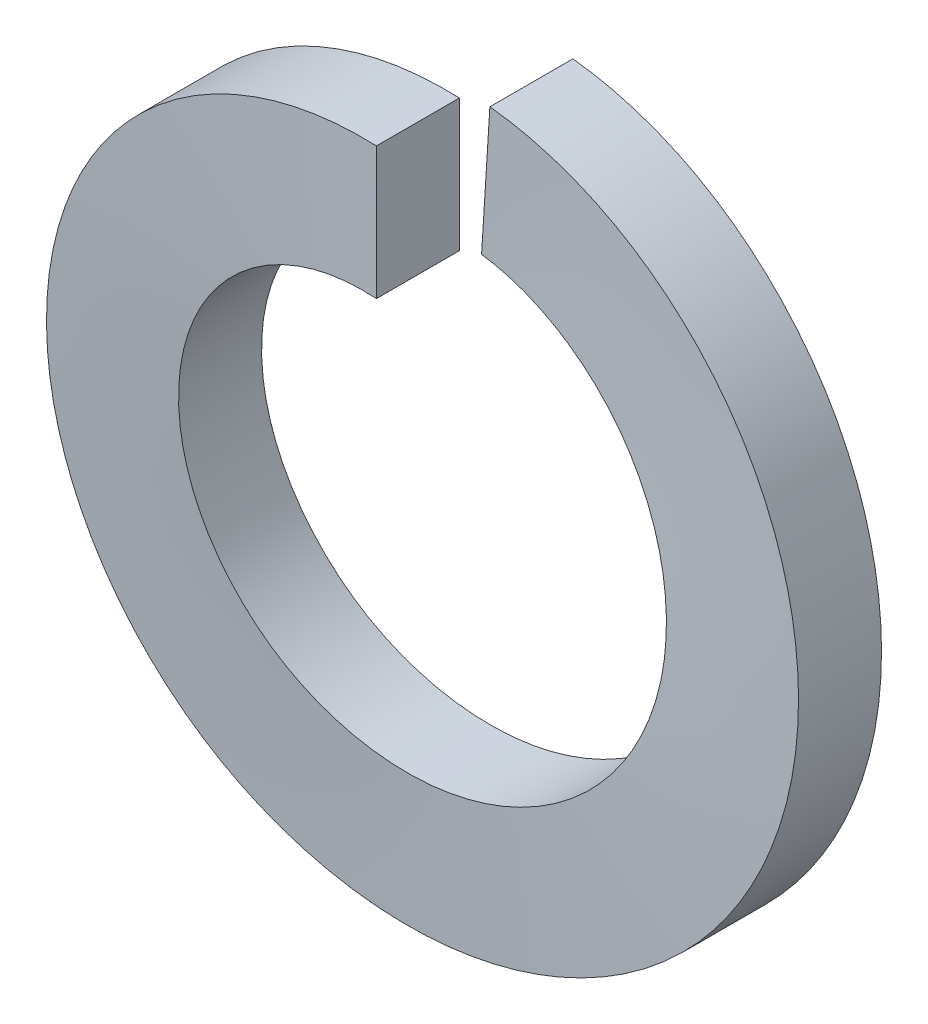
ISO-10303-21;
HEADER;
FILE_DESCRIPTION(('STEP AP214'),'2;1');
FILE_NAME('part.step','',(''),(''),'','','');
FILE_SCHEMA(('AUTOMOTIVE_DESIGN { 1 0 10303 214 1 1 1 1 }'));
ENDSEC;
DATA;
#1=APPLICATION_CONTEXT('core data for automotive mechanical design processes');
#2=APPLICATION_PROTOCOL_DEFINITION('international standard','automotive_design',2000,#1);
#3=PRODUCT_CONTEXT('',#1,'mechanical');
#4=PRODUCT('Part','Part','',(#3));
#5=PRODUCT_RELATED_PRODUCT_CATEGORY('part','',(#4));
#6=PRODUCT_DEFINITION_FORMATION('','',#4);
#7=PRODUCT_DEFINITION_CONTEXT('part definition',#1,'design');
#8=PRODUCT_DEFINITION('design','',#6,#7);
#9=PRODUCT_DEFINITION_SHAPE('','',#8);
#10=(LENGTH_UNIT() NAMED_UNIT(*) SI_UNIT(.MILLI.,.METRE.));
#11=(NAMED_UNIT(*) PLANE_ANGLE_UNIT() SI_UNIT($,.RADIAN.));
#12=(NAMED_UNIT(*) SI_UNIT($,.STERADIAN.) SOLID_ANGLE_UNIT());
#13=UNCERTAINTY_MEASURE_WITH_UNIT(LENGTH_MEASURE(1.E-05),#10,'distance_accuracy_value','');
#14=(GEOMETRIC_REPRESENTATION_CONTEXT(3) GLOBAL_UNCERTAINTY_ASSIGNED_CONTEXT((#13)) GLOBAL_UNIT_ASSIGNED_CONTEXT((#10,
#11,#12)) REPRESENTATION_CONTEXT('',''));
#15=CARTESIAN_POINT('',(0.,0.,0.));
#16=DIRECTION('',(0.,0.,1.));
#17=DIRECTION('',(1.,0.,0.));
#18=AXIS2_PLACEMENT_3D('',#15,#16,#17);
#19=CARTESIAN_POINT('',(0.,2.7625,0.8));
#20=DIRECTION('',(1.,0.,0.));
#21=DIRECTION('',(0.,1.,0.));
#22=AXIS2_PLACEMENT_3D('',#19,#20,#21);
#23=PLANE('',#22);
#24=CARTESIAN_POINT('',(0.,3.4,0.8));
#25=CARTESIAN_POINT('',(0.,2.125,0.8));
#26=(BOUNDED_CURVE() B_SPLINE_CURVE(1,(#24,#25),.UNSPECIFIED.,.F.,
.F.) B_SPLINE_CURVE_WITH_KNOTS((2,2),(0.,1.),
.UNSPECIFIED.) CURVE() GEOMETRIC_REPRESENTATION_ITEM() RATIONAL_B_SPLINE_CURVE((1.,1.)) REPRESENTATION_ITEM(''));
#27=CARTESIAN_POINT('',(0.,3.4,0.8));
#28=VERTEX_POINT('',#27);
#29=CARTESIAN_POINT('',(0.,2.125,0.8));
#30=VERTEX_POINT('',#29);
#31=EDGE_CURVE('E9',#28,#30,#26,.T.);
#32=ORIENTED_EDGE('',*,*,#31,.T.);
#33=CARTESIAN_POINT('',(0.,2.125,0.8));
#34=CARTESIAN_POINT('',(0.,2.125,0.));
#35=(BOUNDED_CURVE() B_SPLINE_CURVE(1,(#33,#34),.UNSPECIFIED.,.F.,
.F.) B_SPLINE_CURVE_WITH_KNOTS((2,2),(0.,1.),
.UNSPECIFIED.) CURVE() GEOMETRIC_REPRESENTATION_ITEM() RATIONAL_B_SPLINE_CURVE((1.,1.)) REPRESENTATION_ITEM(''));
#36=CARTESIAN_POINT('',(0.,2.125,0.));
#37=VERTEX_POINT('',#36);
#38=EDGE_CURVE('E30',#30,#37,#35,.T.);
#39=ORIENTED_EDGE('',*,*,#38,.T.);
#40=CARTESIAN_POINT('',(0.,2.125,0.));
#41=CARTESIAN_POINT('',(0.,3.4,0.));
#42=(BOUNDED_CURVE() B_SPLINE_CURVE(1,(#40,#41),.UNSPECIFIED.,.F.,
.F.) B_SPLINE_CURVE_WITH_KNOTS((2,2),(0.,1.),
.UNSPECIFIED.) CURVE() GEOMETRIC_REPRESENTATION_ITEM() RATIONAL_B_SPLINE_CURVE((1.,1.)) REPRESENTATION_ITEM(''));
#43=CARTESIAN_POINT('',(0.,3.4,0.));
#44=VERTEX_POINT('',#43);
#45=EDGE_CURVE('E82',#37,#44,#42,.T.);
#46=ORIENTED_EDGE('',*,*,#45,.T.);
#47=CARTESIAN_POINT('',(0.,3.4,0.));
#48=CARTESIAN_POINT('',(0.,3.4,0.8));
#49=(BOUNDED_CURVE() B_SPLINE_CURVE(1,(#47,#48),.UNSPECIFIED.,.F.,
.F.) B_SPLINE_CURVE_WITH_KNOTS((2,2),(0.,1.),
.UNSPECIFIED.) CURVE() GEOMETRIC_REPRESENTATION_ITEM() RATIONAL_B_SPLINE_CURVE((1.,1.)) REPRESENTATION_ITEM(''));
#50=EDGE_CURVE('E71',#44,#28,#49,.T.);
#51=ORIENTED_EDGE('',*,*,#50,.T.);
#52=EDGE_LOOP('',(#32,#39,#46,#51));
#53=FACE_BOUND('',#52,.T.);
#54=ADVANCED_FACE('F15',(#53),#23,.T.);
#55=CARTESIAN_POINT('',(0.153454677875225,2.43892716667354,-0.0803570287499307));
#56=DIRECTION('',(0.998026461794073,-0.0627947530776182,2.33393192424572E-05));
#57=DIRECTION('',(0.,-0.000371676238642485,-0.999999930928384));
#58=AXIS2_PLACEMENT_3D('',#55,#56,#57);
#59=PLANE('',#58);
#60=CARTESIAN_POINT('',(0.133445838291757,2.12080579219163,-0.0803565761972662));
#61=CARTESIAN_POINT('',(0.160126620391539,2.54496747826804,-0.0803570287499307));
#62=CARTESIAN_POINT('',(0.186814390456795,2.96912872464604,-0.0803570287499307));
#63=CARTESIAN_POINT('',(0.213502160311887,3.39328997103727,-0.0803570287584372));
#64=(BOUNDED_CURVE() B_SPLINE_CURVE(3,(#60,#61,#62,#63),.UNSPECIFIED.,.F.,
.F.) B_SPLINE_CURVE_WITH_KNOTS((4,4),(0.,1.),
.UNSPECIFIED.) CURVE() GEOMETRIC_REPRESENTATION_ITEM() RATIONAL_B_SPLINE_CURVE((1.,1.,1.,1.)) REPRESENTATION_ITEM(''));
#65=CARTESIAN_POINT('',(0.133445838291757,2.12080579219163,-0.0803565761972662));
#66=VERTEX_POINT('',#65);
#67=CARTESIAN_POINT('',(0.213502160311887,3.39328997103727,-0.0803570287584372));
#68=VERTEX_POINT('',#67);
#69=EDGE_CURVE('E83',#66,#68,#64,.T.);
#70=ORIENTED_EDGE('',*,*,#69,.T.);
#71=CARTESIAN_POINT('',(0.213502160311887,3.39328997103727,-0.0803570287584372));
#72=CARTESIAN_POINT('',(0.213508372057573,3.39328958020091,-0.347023695279839));
#73=CARTESIAN_POINT('',(0.213514583593094,3.39328918937777,-0.613690361801246));
#74=CARTESIAN_POINT('',(0.213513341161694,3.39328926751323,-0.880356576201521));
#75=(BOUNDED_CURVE() B_SPLINE_CURVE(3,(#71,#72,#73,#74),.UNSPECIFIED.,.F.,
.F.) B_SPLINE_CURVE_WITH_KNOTS((4,4),(0.,1.),
.UNSPECIFIED.) CURVE() GEOMETRIC_REPRESENTATION_ITEM() RATIONAL_B_SPLINE_CURVE((1.,1.,1.,1.)) REPRESENTATION_ITEM(''));
#76=CARTESIAN_POINT('',(0.213513341161694,3.39328926751323,-0.880356576201521));
#77=VERTEX_POINT('',#76);
#78=EDGE_CURVE('E21',#68,#77,#75,.T.);
#79=ORIENTED_EDGE('',*,*,#78,.T.);
#80=CARTESIAN_POINT('',(0.213513341161694,3.39328926751323,-0.880356576201521));
#81=CARTESIAN_POINT('',(0.18683302503823,2.96912755211347,-0.880356123666393));
#82=CARTESIAN_POINT('',(0.160145254973551,2.54496630574468,-0.880356123601026));
#83=CARTESIAN_POINT('',(0.133452826257232,2.12080535249323,-0.880356123644601));
#84=(BOUNDED_CURVE() B_SPLINE_CURVE(3,(#80,#81,#82,#83),.UNSPECIFIED.,.F.,
.F.) B_SPLINE_CURVE_WITH_KNOTS((4,4),(0.,1.),
.UNSPECIFIED.) CURVE() GEOMETRIC_REPRESENTATION_ITEM() RATIONAL_B_SPLINE_CURVE((1.,1.,1.,1.)) REPRESENTATION_ITEM(''));
#85=CARTESIAN_POINT('',(0.133452826257232,2.12080535249323,-0.880356123644601));
#86=VERTEX_POINT('',#85);
#87=EDGE_CURVE('E91',#77,#86,#84,.T.);
#88=ORIENTED_EDGE('',*,*,#87,.T.);
#89=CARTESIAN_POINT('',(0.133452826257232,2.12080535249323,-0.880356123644601));
#90=CARTESIAN_POINT('',(0.133451273373352,2.12080545019902,-0.61368945701425));
#91=CARTESIAN_POINT('',(0.133445061837831,2.12080584102217,-0.347022790492843));
#92=CARTESIAN_POINT('',(0.133445838291757,2.12080579219163,-0.0803565761972662));
#93=(BOUNDED_CURVE() B_SPLINE_CURVE(3,(#89,#90,#91,#92),.UNSPECIFIED.,.F.,
.F.) B_SPLINE_CURVE_WITH_KNOTS((4,4),(0.,1.),
.UNSPECIFIED.) CURVE() GEOMETRIC_REPRESENTATION_ITEM() RATIONAL_B_SPLINE_CURVE((1.,1.,1.,1.)) REPRESENTATION_ITEM(''));
#94=EDGE_CURVE('E100',#86,#66,#93,.T.);
#95=ORIENTED_EDGE('',*,*,#94,.T.);
#96=EDGE_LOOP('',(#70,#79,#88,#95));
#97=FACE_BOUND('',#96,.T.);
#98=ADVANCED_FACE('F168',(#97),#59,.F.);
#99=CARTESIAN_POINT('',(0.,3.4,0.8));
#100=CARTESIAN_POINT('',(-1.40832611206852,3.4,0.744444444444444));
#101=CARTESIAN_POINT('',(-2.40416305603426,2.40416305603426,0.688888888888889));
#102=CARTESIAN_POINT('',(-3.4,1.40832611206852,0.633333333333333));
#103=CARTESIAN_POINT('',(-3.4,0.,0.577777777777778));
#104=CARTESIAN_POINT('',(-3.4,-1.40832611206852,0.522222222222222));
#105=CARTESIAN_POINT('',(-2.40416305603426,-2.40416305603426,0.466666666666667));
#106=CARTESIAN_POINT('',(-1.40832611206852,-3.4,0.411111111111111));
#107=CARTESIAN_POINT('',(0.,-3.4,0.355555555555556));
#108=CARTESIAN_POINT('',(1.40832611206852,-3.4,0.3));
#109=CARTESIAN_POINT('',(2.40416305603426,-2.40416305603426,0.244444444444444));
#110=CARTESIAN_POINT('',(3.4,-1.40832611206853,0.188888888888889));
#111=CARTESIAN_POINT('',(3.4,0.,0.133333333333333));
#112=CARTESIAN_POINT('',(3.4,1.40832611206852,0.0777777777777779));
#113=CARTESIAN_POINT('',(2.40416305603426,2.40416305603426,0.0222222222222223));
#114=CARTESIAN_POINT('',(1.49571136721364,3.31261474485489,-0.0284583019073877));
#115=CARTESIAN_POINT('',(0.213502160522052,3.39328997102405,-0.0803570287499305));
#116=CARTESIAN_POINT('',(0.,2.125,0.8));
#117=CARTESIAN_POINT('',(-0.880203820042827,2.125,0.744444444444444));
#118=CARTESIAN_POINT('',(-1.50260191002141,1.50260191002141,0.688888888888889));
#119=CARTESIAN_POINT('',(-2.125,0.880203820042827,0.633333333333333));
#120=CARTESIAN_POINT('',(-2.125,0.,0.577777777777778));
#121=CARTESIAN_POINT('',(-2.125,-0.880203820042827,0.522222222222222));
#122=CARTESIAN_POINT('',(-1.50260191002141,-1.50260191002141,0.466666666666667));
#123=CARTESIAN_POINT('',(-0.880203820042827,-2.125,0.411111111111111));
#124=CARTESIAN_POINT('',(0.,-2.125,0.355555555555556));
#125=CARTESIAN_POINT('',(0.880203820042827,-2.125,0.3));
#126=CARTESIAN_POINT('',(1.50260191002141,-1.50260191002141,0.244444444444444));
#127=CARTESIAN_POINT('',(2.125,-0.880203820042828,0.188888888888889));
#128=CARTESIAN_POINT('',(2.125,0.,0.133333333333333));
#129=CARTESIAN_POINT('',(2.125,0.880203820042827,0.0777777777777777));
#130=CARTESIAN_POINT('',(1.50260191002141,1.50260191002141,0.0222222222222222));
#131=CARTESIAN_POINT('',(0.934819604508523,2.07038421553431,-0.0284583019073878));
#132=CARTESIAN_POINT('',(0.133438850326282,2.12080623189003,-0.0803570287499307));
#133=(BOUNDED_SURFACE() B_SPLINE_SURFACE(1,2,((#99,#100,#101,#102,#103,#104,#105,#106,#107,#108,
#109,#110,#111,#112,#113,#114,#115),(#116,#117,#118,#119,#120,#121,#122,#123,#124,#125,#126,
#127,#128,#129,#130,#131,#132)),.UNSPECIFIED.,.F.,.F.,.F.) B_SPLINE_SURFACE_WITH_KNOTS((2,2),(3,
2,2,2,2,2,2,2,3),(0.,1.),(0.,0.125,0.25,0.375,0.5,0.625,0.75,0.875,0.989797985532251),
.UNSPECIFIED.) GEOMETRIC_REPRESENTATION_ITEM() RATIONAL_B_SPLINE_SURFACE(((1.,0.923879532511287,
1.,0.923879532511287,1.,0.923879532511287,1.,0.923879532511287,1.,0.923879532511287,1.,
0.923879532511287,1.,0.923879532511287,1.,0.93009218939618,0.988588792076979),(1.,
0.923879532511287,1.,0.923879532511287,1.,0.923879532511287,1.,0.923879532511287,1.,
0.923879532511287,1.,0.923879532511287,1.,0.923879532511287,1.,0.93009218939618,0.988588792076979))) REPRESENTATION_ITEM('') SURFACE());
#134=CARTESIAN_POINT('',(0.,3.4,0.8));
#135=CARTESIAN_POINT('',(-1.40832611206852,3.4,0.744444444444444));
#136=CARTESIAN_POINT('',(-2.40416305603426,2.40416305603426,0.688888888888889));
#137=CARTESIAN_POINT('',(-3.4,1.40832611206852,0.633333333333333));
#138=CARTESIAN_POINT('',(-3.4,0.,0.577777777777778));
#139=CARTESIAN_POINT('',(-3.4,-1.40832611206852,0.522222222222222));
#140=CARTESIAN_POINT('',(-2.40416305603426,-2.40416305603426,0.466666666666667));
#141=CARTESIAN_POINT('',(-1.40832611206852,-3.4,0.411111111111111));
#142=CARTESIAN_POINT('',(0.,-3.4,0.355555555555556));
#143=CARTESIAN_POINT('',(1.40832611206852,-3.4,0.3));
#144=CARTESIAN_POINT('',(2.40416305603426,-2.40416305603426,0.244444444444444));
#145=CARTESIAN_POINT('',(3.4,-1.40832611206853,0.188888888888889));
#146=CARTESIAN_POINT('',(3.4,0.,0.133333333333333));
#147=CARTESIAN_POINT('',(3.4,1.40832611206852,0.0777777777777779));
#148=CARTESIAN_POINT('',(2.40416305603426,2.40416305603426,0.0222222222222223));
#149=CARTESIAN_POINT('',(1.49571136712855,3.31261474493997,-0.0284583019121342));
#150=CARTESIAN_POINT('',(0.213502160311887,3.39328997103728,-0.0803570287584372));
#151=(BOUNDED_CURVE() B_SPLINE_CURVE(2,(#134,#135,#136,#137,#138,#139,#140,#141,#142,#143,#144,
#145,#146,#147,#148,#149,#150),.UNSPECIFIED.,.F.,.F.) B_SPLINE_CURVE_WITH_KNOTS((3,2,2,2,2,2,2,
2,3),(0.,0.125,0.25,0.375,0.5,0.625,0.75,0.875,0.989797985542251),
.UNSPECIFIED.) CURVE() GEOMETRIC_REPRESENTATION_ITEM() RATIONAL_B_SPLINE_CURVE((1.,
0.923879532511287,1.,0.923879532511287,1.,0.923879532511287,1.,0.923879532511287,1.,
0.923879532511287,1.,0.923879532511287,1.,0.923879532511287,1.,0.93009218939009,0.98858879208717)) REPRESENTATION_ITEM(''));
#152=EDGE_CURVE('E78',#28,#68,#151,.T.);
#153=CARTESIAN_POINT('',(0.,2.125,0.8));
#154=CARTESIAN_POINT('',(-0.880203820042827,2.125,0.744444444444444));
#155=CARTESIAN_POINT('',(-1.50260191002141,1.50260191002141,0.688888888888889));
#156=CARTESIAN_POINT('',(-2.125,0.880203820042827,0.633333333333333));
#157=CARTESIAN_POINT('',(-2.125,0.,0.577777777777778));
#158=CARTESIAN_POINT('',(-2.125,-0.880203820042827,0.522222222222222));
#159=CARTESIAN_POINT('',(-1.50260191002141,-1.50260191002141,0.466666666666666));
#160=CARTESIAN_POINT('',(-0.880203820042827,-2.125,0.411111111111111));
#161=CARTESIAN_POINT('',(0.,-2.125,0.355555555555556));
#162=CARTESIAN_POINT('',(0.880203820042826,-2.125,0.3));
#163=CARTESIAN_POINT('',(1.50260191002141,-1.50260191002141,0.244444444444444));
#164=CARTESIAN_POINT('',(2.125,-0.880203820042828,0.188888888888889));
#165=CARTESIAN_POINT('',(2.125,0.,0.133333333333333));
#166=CARTESIAN_POINT('',(2.125,0.880203820042827,0.0777777777777776));
#167=CARTESIAN_POINT('',(1.50260191002141,1.50260191002141,0.022222222222222));
#168=CARTESIAN_POINT('',(0.934825262430228,2.0703785576126,-0.0284577968785508));
#169=CARTESIAN_POINT('',(0.133452826257233,2.12080535249324,-0.0803561236446017));
#170=CARTESIAN_POINT('',(0.133445838289374,2.1208057922149,-0.080356576198025));
#171=CARTESIAN_POINT('',(0.133445838291758,2.12080579219163,-0.0803565761972663));
#172=(BOUNDED_CURVE() B_SPLINE_CURVE(2,(#153,#154,#155,#156,#157,#158,#159,#160,#161,#162,#163,
#164,#165,#166,#167,#168,#169,#170,#171),.UNSPECIFIED.,.F.,.F.) B_SPLINE_CURVE_WITH_KNOTS((3,2,
2,2,2,2,2,2,2,3),(0.,0.126288396043545,0.25257679208709,0.378865188130635,0.50515358417418,
0.631441980217725,0.75773037626127,0.884018772304816,0.999998925047978,1.),
.UNSPECIFIED.) CURVE() GEOMETRIC_REPRESENTATION_ITEM() RATIONAL_B_SPLINE_CURVE((1.,
0.923879532511287,1.,0.923879532511287,1.,0.923879532511287,1.,0.923879532511287,1.,
0.923879532511287,1.,0.923879532511287,1.,0.923879532511287,1.,0.930092837324675,
0.988587707756646,0.988587707756646,0.988587707756646)) REPRESENTATION_ITEM(''));
#173=EDGE_CURVE('E103',#30,#66,#172,.T.);
#174=ORIENTED_EDGE('',*,*,#31,.F.);
#175=ORIENTED_EDGE('',*,*,#152,.T.);
#176=ORIENTED_EDGE('',*,*,#69,.F.);
#177=ORIENTED_EDGE('',*,*,#173,.F.);
#178=EDGE_LOOP('',(#174,#175,#176,#177));
#179=FACE_BOUND('',#178,.T.);
#180=ADVANCED_FACE('F241',(#179),#133,.F.);
#181=CARTESIAN_POINT('',(0.,3.4,0.));
#182=CARTESIAN_POINT('',(-1.40832611206852,3.4,-0.0555555555555556));
#183=CARTESIAN_POINT('',(-2.40416305603426,2.40416305603426,-0.111111111111111));
#184=CARTESIAN_POINT('',(-3.4,1.40832611206852,-0.166666666666667));
#185=CARTESIAN_POINT('',(-3.4,0.,-0.222222222222222));
#186=CARTESIAN_POINT('',(-3.4,-1.40832611206852,-0.277777777777778));
#187=CARTESIAN_POINT('',(-2.40416305603426,-2.40416305603426,-0.333333333333334));
#188=CARTESIAN_POINT('',(-1.40832611206852,-3.4,-0.388888888888889));
#189=CARTESIAN_POINT('',(0.,-3.4,-0.444444444444445));
#190=CARTESIAN_POINT('',(1.40832611206852,-3.4,-0.499999999999999));
#191=CARTESIAN_POINT('',(2.40416305603426,-2.40416305603426,-0.555555555555556));
#192=CARTESIAN_POINT('',(3.4,-1.40832611206853,-0.611111111111112));
#193=CARTESIAN_POINT('',(3.4,0.,-0.666666666666667));
#194=CARTESIAN_POINT('',(3.4,1.40832611206852,-0.722222222222222));
#195=CARTESIAN_POINT('',(2.40416305603426,2.40416305603426,-0.777777777777778));
#196=CARTESIAN_POINT('',(1.49571136712855,3.31261474493997,-0.828458301912135));
#197=CARTESIAN_POINT('',(0.213502160311887,3.39328997103728,-0.880357028758437));
#198=CARTESIAN_POINT('',(0.,3.4,0.8));
#199=CARTESIAN_POINT('',(-1.40832611206852,3.4,0.744444444444444));
#200=CARTESIAN_POINT('',(-2.40416305603426,2.40416305603426,0.688888888888889));
#201=CARTESIAN_POINT('',(-3.4,1.40832611206852,0.633333333333333));
#202=CARTESIAN_POINT('',(-3.4,0.,0.577777777777778));
#203=CARTESIAN_POINT('',(-3.4,-1.40832611206852,0.522222222222222));
#204=CARTESIAN_POINT('',(-2.40416305603426,-2.40416305603426,0.466666666666667));
#205=CARTESIAN_POINT('',(-1.40832611206852,-3.4,0.411111111111111));
#206=CARTESIAN_POINT('',(0.,-3.4,0.355555555555556));
#207=CARTESIAN_POINT('',(1.40832611206852,-3.4,0.3));
#208=CARTESIAN_POINT('',(2.40416305603426,-2.40416305603426,0.244444444444444));
#209=CARTESIAN_POINT('',(3.4,-1.40832611206853,0.188888888888889));
#210=CARTESIAN_POINT('',(3.4,0.,0.133333333333333));
#211=CARTESIAN_POINT('',(3.4,1.40832611206852,0.0777777777777779));
#212=CARTESIAN_POINT('',(2.40416305603426,2.40416305603426,0.0222222222222223));
#213=CARTESIAN_POINT('',(1.49571136712855,3.31261474493997,-0.0284583019121342));
#214=CARTESIAN_POINT('',(0.213502160311887,3.39328997103728,-0.0803570287584372));
#215=(BOUNDED_SURFACE() B_SPLINE_SURFACE(1,2,((#181,#182,#183,#184,#185,#186,#187,#188,#189,
#190,#191,#192,#193,#194,#195,#196,#197),(#198,#199,#200,#201,#202,#203,#204,#205,#206,#207,
#208,#209,#210,#211,#212,#213,#214)),.UNSPECIFIED.,.F.,.F.,.F.) B_SPLINE_SURFACE_WITH_KNOTS((2,
2),(3,2,2,2,2,2,2,2,3),(0.,1.),(0.,0.125,0.25,0.375,0.5,0.625,0.75,0.875,0.989797985542251),
.UNSPECIFIED.) GEOMETRIC_REPRESENTATION_ITEM() RATIONAL_B_SPLINE_SURFACE(((1.,0.923879532511287,
1.,0.923879532511287,1.,0.923879532511287,1.,0.923879532511287,1.,0.923879532511287,1.,
0.923879532511287,1.,0.923879532511287,1.,0.93009218939009,0.98858879208717),(1.,
0.923879532511287,1.,0.923879532511287,1.,0.923879532511287,1.,0.923879532511287,1.,
0.923879532511287,1.,0.923879532511287,1.,0.923879532511287,1.,0.93009218939009,0.98858879208717))) REPRESENTATION_ITEM('') SURFACE());
#216=CARTESIAN_POINT('',(0.,3.4,0.));
#217=CARTESIAN_POINT('',(-1.40832611206852,3.4,-0.0555555555555558));
#218=CARTESIAN_POINT('',(-2.40416305603426,2.40416305603426,-0.111111111111111));
#219=CARTESIAN_POINT('',(-3.4,1.40832611206852,-0.166666666666667));
#220=CARTESIAN_POINT('',(-3.4,0.,-0.222222222222223));
#221=CARTESIAN_POINT('',(-3.4,-1.40832611206852,-0.277777777777778));
#222=CARTESIAN_POINT('',(-2.40416305603426,-2.40416305603426,-0.333333333333334));
#223=CARTESIAN_POINT('',(-1.40832611206852,-3.4,-0.388888888888889));
#224=CARTESIAN_POINT('',(0.,-3.4,-0.444444444444445));
#225=CARTESIAN_POINT('',(1.40832611206852,-3.4,-0.500000000000001));
#226=CARTESIAN_POINT('',(2.40416305603426,-2.40416305603426,-0.555555555555556));
#227=CARTESIAN_POINT('',(3.4,-1.40832611206853,-0.611111111111112));
#228=CARTESIAN_POINT('',(3.4,0.,-0.666666666666667));
#229=CARTESIAN_POINT('',(3.4,1.40832611206852,-0.722222222222222));
#230=CARTESIAN_POINT('',(2.40416305603426,2.40416305603426,-0.777777777777778));
#231=CARTESIAN_POINT('',(1.49572041988834,3.31260569218019,-0.828457796878553));
#232=CARTESIAN_POINT('',(0.213513341161694,3.39328926751323,-0.880356576201521));
#233=(BOUNDED_CURVE() B_SPLINE_CURVE(2,(#216,#217,#218,#219,#220,#221,#222,#223,#224,#225,#226,
#227,#228,#229,#230,#231,#232),.UNSPECIFIED.,.F.,.F.) B_SPLINE_CURVE_WITH_KNOTS((3,2,2,2,2,2,2,
2,3),(0.,0.126288531797657,0.252577063595315,0.378865595392971,0.505154127190629,
0.631442658988286,0.757731190785943,0.884019722583601,1.),
.UNSPECIFIED.) CURVE() GEOMETRIC_REPRESENTATION_ITEM() RATIONAL_B_SPLINE_CURVE((1.,
0.923879532511287,1.,0.923879532511287,1.,0.923879532511287,1.,0.923879532511287,1.,
0.923879532511287,1.,0.923879532511287,1.,0.923879532511287,1.,0.930092837324673,0.98858770775665)) REPRESENTATION_ITEM(''));
#234=EDGE_CURVE('E76',#44,#77,#233,.T.);
#235=ORIENTED_EDGE('',*,*,#50,.F.);
#236=ORIENTED_EDGE('',*,*,#234,.T.);
#237=ORIENTED_EDGE('',*,*,#78,.F.);
#238=ORIENTED_EDGE('',*,*,#152,.F.);
#239=EDGE_LOOP('',(#235,#236,#237,#238));
#240=FACE_BOUND('',#239,.T.);
#241=ADVANCED_FACE('F73',(#240),#215,.F.);
#242=CARTESIAN_POINT('',(0.,2.125,0.));
#243=CARTESIAN_POINT('',(-0.880203820042827,2.125,-0.0555555555555556));
#244=CARTESIAN_POINT('',(-1.50260191002141,1.50260191002141,-0.111111111111111));
#245=CARTESIAN_POINT('',(-2.125,0.880203820042827,-0.166666666666667));
#246=CARTESIAN_POINT('',(-2.125,0.,-0.222222222222222));
#247=CARTESIAN_POINT('',(-2.125,-0.880203820042827,-0.277777777777778));
#248=CARTESIAN_POINT('',(-1.50260191002141,-1.50260191002141,-0.333333333333334));
#249=CARTESIAN_POINT('',(-0.880203820042827,-2.125,-0.388888888888889));
#250=CARTESIAN_POINT('',(0.,-2.125,-0.444444444444445));
#251=CARTESIAN_POINT('',(0.880203820042827,-2.125,-0.499999999999999));
#252=CARTESIAN_POINT('',(1.50260191002141,-1.50260191002141,-0.555555555555556));
#253=CARTESIAN_POINT('',(2.125,-0.880203820042828,-0.611111111111112));
#254=CARTESIAN_POINT('',(2.125,0.,-0.666666666666667));
#255=CARTESIAN_POINT('',(2.125,0.880203820042827,-0.722222222222222));
#256=CARTESIAN_POINT('',(1.50260191002141,1.50260191002141,-0.777777777777778));
#257=CARTESIAN_POINT('',(0.934825262430211,2.07037855761262,-0.828457796878553));
#258=CARTESIAN_POINT('',(0.133452826257189,2.12080535249324,-0.880356123644604));
#259=CARTESIAN_POINT('',(0.,3.4,0.));
#260=CARTESIAN_POINT('',(-1.40832611206852,3.4,-0.0555555555555556));
#261=CARTESIAN_POINT('',(-2.40416305603426,2.40416305603426,-0.111111111111111));
#262=CARTESIAN_POINT('',(-3.4,1.40832611206852,-0.166666666666667));
#263=CARTESIAN_POINT('',(-3.4,0.,-0.222222222222222));
#264=CARTESIAN_POINT('',(-3.4,-1.40832611206852,-0.277777777777778));
#265=CARTESIAN_POINT('',(-2.40416305603426,-2.40416305603426,-0.333333333333334));
#266=CARTESIAN_POINT('',(-1.40832611206852,-3.4,-0.388888888888889));
#267=CARTESIAN_POINT('',(0.,-3.4,-0.444444444444445));
#268=CARTESIAN_POINT('',(1.40832611206852,-3.4,-0.499999999999999));
#269=CARTESIAN_POINT('',(2.40416305603426,-2.40416305603426,-0.555555555555556));
#270=CARTESIAN_POINT('',(3.4,-1.40832611206853,-0.611111111111112));
#271=CARTESIAN_POINT('',(3.4,0.,-0.666666666666667));
#272=CARTESIAN_POINT('',(3.4,1.40832611206852,-0.722222222222222));
#273=CARTESIAN_POINT('',(2.40416305603426,2.40416305603426,-0.777777777777778));
#274=CARTESIAN_POINT('',(1.49572041988834,3.31260569218019,-0.828457796878553));
#275=CARTESIAN_POINT('',(0.213524522011502,3.39328856398918,-0.880356123644604));
#276=(BOUNDED_SURFACE() B_SPLINE_SURFACE(1,2,((#242,#243,#244,#245,#246,#247,#248,#249,#250,
#251,#252,#253,#254,#255,#256,#257,#258),(#259,#260,#261,#262,#263,#264,#265,#266,#267,#268,
#269,#270,#271,#272,#273,#274,#275)),.UNSPECIFIED.,.F.,.F.,.F.) B_SPLINE_SURFACE_WITH_KNOTS((2,
2),(3,2,2,2,2,2,2,2,3),(0.,1.),(0.,0.125,0.25,0.375,0.5,0.625,0.75,0.875,0.989796921546908),
.UNSPECIFIED.) GEOMETRIC_REPRESENTATION_ITEM() RATIONAL_B_SPLINE_SURFACE(((1.,0.923879532511287,
1.,0.923879532511287,1.,0.923879532511287,1.,0.923879532511287,1.,0.923879532511287,1.,
0.923879532511287,1.,0.923879532511287,1.,0.930092837324673,0.98858770775665),(1.,
0.923879532511287,1.,0.923879532511287,1.,0.923879532511287,1.,0.923879532511287,1.,
0.923879532511287,1.,0.923879532511287,1.,0.923879532511287,1.,0.930092837324673,0.98858770775665))) REPRESENTATION_ITEM('') SURFACE());
#277=CARTESIAN_POINT('',(0.,2.125,0.));
#278=CARTESIAN_POINT('',(-0.880203820042827,2.125,-0.0555555555555556));
#279=CARTESIAN_POINT('',(-1.50260191002141,1.50260191002141,-0.111111111111111));
#280=CARTESIAN_POINT('',(-2.125,0.880203820042827,-0.166666666666667));
#281=CARTESIAN_POINT('',(-2.125,0.,-0.222222222222222));
#282=CARTESIAN_POINT('',(-2.125,-0.880203820042827,-0.277777777777778));
#283=CARTESIAN_POINT('',(-1.50260191002141,-1.50260191002141,-0.333333333333334));
#284=CARTESIAN_POINT('',(-0.880203820042827,-2.125,-0.388888888888889));
#285=CARTESIAN_POINT('',(0.,-2.125,-0.444444444444445));
#286=CARTESIAN_POINT('',(0.880203820042827,-2.125,-0.499999999999999));
#287=CARTESIAN_POINT('',(1.50260191002141,-1.50260191002141,-0.555555555555556));
#288=CARTESIAN_POINT('',(2.125,-0.880203820042828,-0.611111111111112));
#289=CARTESIAN_POINT('',(2.125,0.,-0.666666666666667));
#290=CARTESIAN_POINT('',(2.125,0.880203820042827,-0.722222222222222));
#291=CARTESIAN_POINT('',(1.50260191002141,1.50260191002141,-0.777777777777778));
#292=CARTESIAN_POINT('',(0.934825262430227,2.0703785576126,-0.82845779687855));
#293=CARTESIAN_POINT('',(0.133452826257233,2.12080535249324,-0.880356123644601));
#294=(BOUNDED_CURVE() B_SPLINE_CURVE(2,(#277,#278,#279,#280,#281,#282,#283,#284,#285,#286,#287,
#288,#289,#290,#291,#292,#293),.UNSPECIFIED.,.F.,.F.) B_SPLINE_CURVE_WITH_KNOTS((3,2,2,2,2,2,2,
2,3),(0.,0.125,0.25,0.375,0.5,0.625,0.75,0.875,0.989796921546905),
.UNSPECIFIED.) CURVE() GEOMETRIC_REPRESENTATION_ITEM() RATIONAL_B_SPLINE_CURVE((1.,
0.923879532511287,1.,0.923879532511287,1.,0.923879532511287,1.,0.923879532511287,1.,
0.923879532511287,1.,0.923879532511287,1.,0.923879532511287,1.,0.930092837324676,0.988587707756646)) REPRESENTATION_ITEM(''));
#295=EDGE_CURVE('E94',#37,#86,#294,.T.);
#296=ORIENTED_EDGE('',*,*,#45,.F.);
#297=ORIENTED_EDGE('',*,*,#295,.T.);
#298=ORIENTED_EDGE('',*,*,#87,.F.);
#299=ORIENTED_EDGE('',*,*,#234,.F.);
#300=EDGE_LOOP('',(#296,#297,#298,#299));
#301=FACE_BOUND('',#300,.T.);
#302=ADVANCED_FACE('F89',(#301),#276,.F.);
#303=CARTESIAN_POINT('',(0.,2.125,0.8));
#304=CARTESIAN_POINT('',(-0.880203820042827,2.125,0.744444444444444));
#305=CARTESIAN_POINT('',(-1.50260191002141,1.50260191002141,0.688888888888889));
#306=CARTESIAN_POINT('',(-2.125,0.880203820042827,0.633333333333333));
#307=CARTESIAN_POINT('',(-2.125,0.,0.577777777777778));
#308=CARTESIAN_POINT('',(-2.125,-0.880203820042827,0.522222222222222));
#309=CARTESIAN_POINT('',(-1.50260191002141,-1.50260191002141,0.466666666666666));
#310=CARTESIAN_POINT('',(-0.880203820042827,-2.125,0.411111111111111));
#311=CARTESIAN_POINT('',(0.,-2.125,0.355555555555556));
#312=CARTESIAN_POINT('',(0.880203820042827,-2.125,0.3));
#313=CARTESIAN_POINT('',(1.50260191002141,-1.50260191002141,0.244444444444444));
#314=CARTESIAN_POINT('',(2.125,-0.880203820042828,0.188888888888889));
#315=CARTESIAN_POINT('',(2.125,0.,0.133333333333333));
#316=CARTESIAN_POINT('',(2.125,0.880203820042827,0.0777777777777775));
#317=CARTESIAN_POINT('',(1.50260191002141,1.50260191002141,0.022222222222222));
#318=CARTESIAN_POINT('',(0.934825262430227,2.0703785576126,-0.0284577968785508));
#319=CARTESIAN_POINT('',(0.133452826257233,2.12080535249324,-0.0803561236446017));
#320=CARTESIAN_POINT('',(0.0684456426337388,2.12489596475588,-0.0845661063012855));
#321=CARTESIAN_POINT('',(0.00343845901024517,2.12898657701851,-0.0887760889579693));
#322=CARTESIAN_POINT('',(0.,2.125,0.));
#323=CARTESIAN_POINT('',(-0.880203820042827,2.125,-0.0555555555555556));
#324=CARTESIAN_POINT('',(-1.50260191002141,1.50260191002141,-0.111111111111111));
#325=CARTESIAN_POINT('',(-2.125,0.880203820042827,-0.166666666666667));
#326=CARTESIAN_POINT('',(-2.125,0.,-0.222222222222222));
#327=CARTESIAN_POINT('',(-2.125,-0.880203820042827,-0.277777777777778));
#328=CARTESIAN_POINT('',(-1.50260191002141,-1.50260191002141,-0.333333333333334));
#329=CARTESIAN_POINT('',(-0.880203820042827,-2.125,-0.388888888888889));
#330=CARTESIAN_POINT('',(0.,-2.125,-0.444444444444445));
#331=CARTESIAN_POINT('',(0.880203820042827,-2.125,-0.499999999999999));
#332=CARTESIAN_POINT('',(1.50260191002141,-1.50260191002141,-0.555555555555556));
#333=CARTESIAN_POINT('',(2.125,-0.880203820042828,-0.611111111111112));
#334=CARTESIAN_POINT('',(2.125,0.,-0.666666666666667));
#335=CARTESIAN_POINT('',(2.125,0.880203820042827,-0.722222222222222));
#336=CARTESIAN_POINT('',(1.50260191002141,1.50260191002141,-0.777777777777778));
#337=CARTESIAN_POINT('',(0.934825262430227,2.0703785576126,-0.82845779687855));
#338=CARTESIAN_POINT('',(0.133452826257233,2.12080535249324,-0.880356123644601));
#339=CARTESIAN_POINT('',(0.0684456426337388,2.12489596475588,-0.884566106301286));
#340=CARTESIAN_POINT('',(0.00343845901024517,2.12898657701851,-0.88877608895797));
#341=(BOUNDED_SURFACE() B_SPLINE_SURFACE(1,2,((#303,#304,#305,#306,#307,#308,#309,#310,#311,
#312,#313,#314,#315,#316,#317,#318,#319,#320,#321),(#322,#323,#324,#325,#326,#327,#328,#329,
#330,#331,#332,#333,#334,#335,#336,#337,#338,#339,#340)),.UNSPECIFIED.,.F.,.F.,
.F.) B_SPLINE_SURFACE_WITH_KNOTS((2,2),(3,2,2,2,2,2,2,2,2,3),(0.,1.),(0.,0.125,0.25,0.375,0.5,
0.625,0.75,0.875,0.989796921546905,0.999694890762374),
.UNSPECIFIED.) GEOMETRIC_REPRESENTATION_ITEM() RATIONAL_B_SPLINE_SURFACE(((1.,0.923879532511287,
1.,0.923879532511287,1.,0.923879532511287,1.,0.923879532511287,1.,0.923879532511287,1.,
0.923879532511287,1.,0.923879532511287,1.,0.930092837324676,0.988587707756646,0.988587707756646,
0.988587707756646),(1.,0.923879532511287,1.,0.923879532511287,1.,0.923879532511287,1.,
0.923879532511287,1.,0.923879532511287,1.,0.923879532511287,1.,0.923879532511287,1.,
0.930092837324676,0.988587707756646,0.988587707756646,0.988587707756646))) REPRESENTATION_ITEM('') SURFACE());
#342=ORIENTED_EDGE('',*,*,#38,.F.);
#343=ORIENTED_EDGE('',*,*,#173,.T.);
#344=ORIENTED_EDGE('',*,*,#94,.F.);
#345=ORIENTED_EDGE('',*,*,#295,.F.);
#346=EDGE_LOOP('',(#342,#343,#344,#345));
#347=FACE_BOUND('',#346,.T.);
#348=ADVANCED_FACE('F17',(#347),#341,.F.);
#349=CLOSED_SHELL('',(#54,#98,#180,#241,#302,#348));
#350=MANIFOLD_SOLID_BREP('B1',#349);
#351=ADVANCED_BREP_SHAPE_REPRESENTATION('',(#18,#350),#14);
#352=SHAPE_DEFINITION_REPRESENTATION(#9,#351);
ENDSEC;
END-ISO-10303-21;
